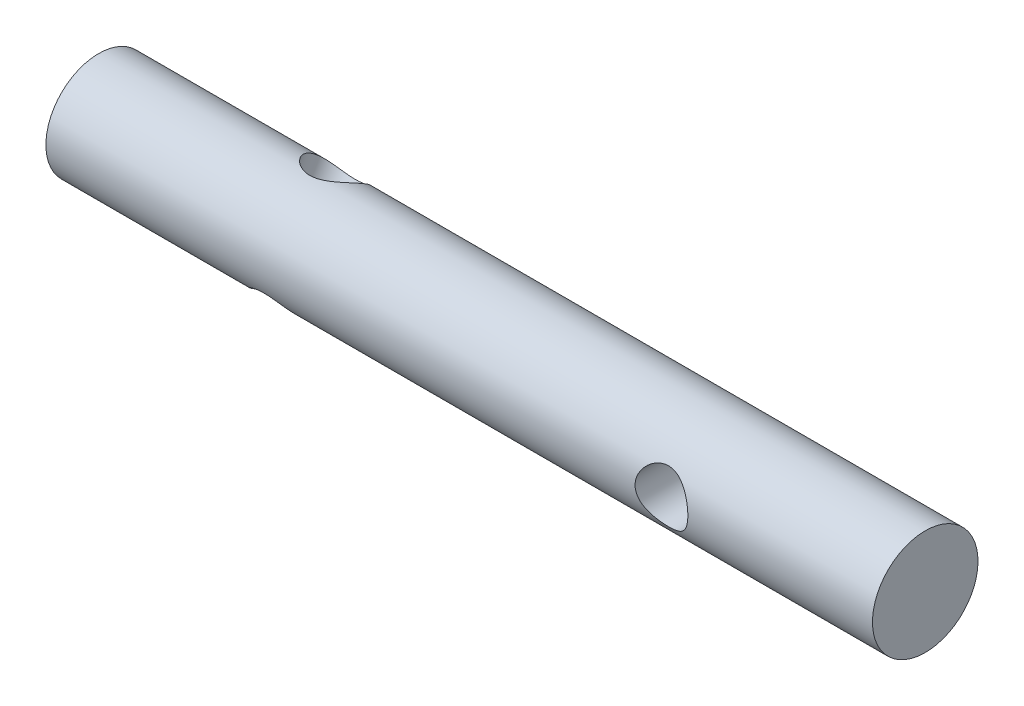
ISO-10303-21;
HEADER;
FILE_DESCRIPTION(('STEP AP214'),'2;1');
FILE_NAME('part.step','',(''),(''),'','','');
FILE_SCHEMA(('AUTOMOTIVE_DESIGN { 1 0 10303 214 1 1 1 1 }'));
ENDSEC;
DATA;
#1=APPLICATION_CONTEXT('core data for automotive mechanical design processes');
#2=APPLICATION_PROTOCOL_DEFINITION('international standard','automotive_design',2000,#1);
#3=PRODUCT_CONTEXT('',#1,'mechanical');
#4=PRODUCT('Part','Part','',(#3));
#5=PRODUCT_RELATED_PRODUCT_CATEGORY('part','',(#4));
#6=PRODUCT_DEFINITION_FORMATION('','',#4);
#7=PRODUCT_DEFINITION_CONTEXT('part definition',#1,'design');
#8=PRODUCT_DEFINITION('design','',#6,#7);
#9=PRODUCT_DEFINITION_SHAPE('','',#8);
#10=(LENGTH_UNIT() NAMED_UNIT(*) SI_UNIT(.MILLI.,.METRE.));
#11=(NAMED_UNIT(*) PLANE_ANGLE_UNIT() SI_UNIT($,.RADIAN.));
#12=(NAMED_UNIT(*) SI_UNIT($,.STERADIAN.) SOLID_ANGLE_UNIT());
#13=UNCERTAINTY_MEASURE_WITH_UNIT(LENGTH_MEASURE(1.E-05),#10,'distance_accuracy_value','');
#14=(GEOMETRIC_REPRESENTATION_CONTEXT(3) GLOBAL_UNCERTAINTY_ASSIGNED_CONTEXT((#13)) GLOBAL_UNIT_ASSIGNED_CONTEXT((#10,
#11,#12)) REPRESENTATION_CONTEXT('',''));
#15=CARTESIAN_POINT('',(0.,0.,0.));
#16=DIRECTION('',(0.,0.,1.));
#17=DIRECTION('',(1.,0.,0.));
#18=AXIS2_PLACEMENT_3D('',#15,#16,#17);
#19=CARTESIAN_POINT('',(23.5,0.,0.));
#20=DIRECTION('',(-1.,0.,0.));
#21=DIRECTION('',(0.,0.,1.));
#22=AXIS2_PLACEMENT_3D('',#19,#20,#21);
#23=CYLINDRICAL_SURFACE('',#22,3.);
#24=CARTESIAN_POINT('',(-11.5,-1.49999999999999,2.59807621135332));
#25=CARTESIAN_POINT('',(-11.4218382877071,-1.50000862495779,2.59807489163534));
#26=CARTESIAN_POINT('',(-11.3435778827124,-1.5061760913131,2.5945405203329));
#27=CARTESIAN_POINT('',(-11.1894591029843,-1.53024117474818,2.58041553106382));
#28=CARTESIAN_POINT('',(-11.1136061274349,-1.54816343991203,2.56981008531852));
#29=CARTESIAN_POINT('',(-10.9668225034841,-1.59396640241377,2.54164960362352));
#30=CARTESIAN_POINT('',(-10.8958680212896,-1.62179412158731,2.52413148619179));
#31=CARTESIAN_POINT('',(-10.7598636970049,-1.68537217841439,2.48212970182895));
#32=CARTESIAN_POINT('',(-10.6948141746063,-1.72112294465765,2.45764565806232));
#33=CARTESIAN_POINT('',(-10.5665414071637,-1.80168953690998,2.39928825432991));
#34=CARTESIAN_POINT('',(-10.5039112964897,-1.84700983188558,2.36480703823351));
#35=CARTESIAN_POINT('',(-10.3878874173899,-1.94208348109413,2.2873722217759));
#36=CARTESIAN_POINT('',(-10.3344982561247,-1.99183902794257,2.24441441804235));
#37=CARTESIAN_POINT('',(-10.2349492732785,-2.09685921277507,2.14677761574316));
#38=CARTESIAN_POINT('',(-10.1895193482107,-2.15226912728264,2.09150371252971));
#39=CARTESIAN_POINT('',(-10.1122887201314,-2.26255337256748,1.97166528686268));
#40=CARTESIAN_POINT('',(-10.0804794157942,-2.31742801990067,1.90710666216055));
#41=CARTESIAN_POINT('',(-10.0337430080484,-2.41999926836365,1.77485215024177));
#42=CARTESIAN_POINT('',(-10.0177757104667,-2.46792879153452,1.7077063502269));
#43=CARTESIAN_POINT('',(-9.99975082198745,-2.55874675688021,1.5683481287634));
#44=CARTESIAN_POINT('',(-9.99768481480644,-2.60163823378903,1.49613879970134));
#45=CARTESIAN_POINT('',(-10.0071200109555,-2.67737164944847,1.35554572990428));
#46=CARTESIAN_POINT('',(-10.0174570232818,-2.71076315078899,1.28737537231279));
#47=CARTESIAN_POINT('',(-10.049321265857,-2.77144236671133,1.15094836839947));
#48=CARTESIAN_POINT('',(-10.0708493334643,-2.7987296243312,1.08269171600203));
#49=CARTESIAN_POINT('',(-10.1246238491347,-2.84747758688166,0.94717164473698));
#50=CARTESIAN_POINT('',(-10.1570144697581,-2.86885245562036,0.879935033322773));
#51=CARTESIAN_POINT('',(-10.2313951243022,-2.90571806648624,0.749278055975659));
#52=CARTESIAN_POINT('',(-10.2733885949535,-2.92120669671257,0.685859066607907));
#53=CARTESIAN_POINT('',(-10.3703430272995,-2.94829088935395,0.558742216123417));
#54=CARTESIAN_POINT('',(-10.426154542489,-2.95938005266745,0.495584669819372));
#55=CARTESIAN_POINT('',(-10.5468845873953,-2.97671044952062,0.377816479613451));
#56=CARTESIAN_POINT('',(-10.6118100584111,-2.98294796407822,0.323212417851254));
#57=CARTESIAN_POINT('',(-10.7539722886361,-2.99227023377267,0.221560607904281));
#58=CARTESIAN_POINT('',(-10.8317290345813,-2.99512962226658,0.175212918700935));
#59=CARTESIAN_POINT('',(-10.9944065070385,-2.99867364292841,0.0974084034876274));
#60=CARTESIAN_POINT('',(-11.0793196495263,-2.99936054836896,0.0659360413893476));
#61=CARTESIAN_POINT('',(-11.2468217669242,-2.99999226031255,0.0222000573363196));
#62=CARTESIAN_POINT('',(-11.3290616785653,-2.99999156123136,0.00861186912431814));
#63=CARTESIAN_POINT('',(-11.4946020122748,-3.00000545022047,-0.00262428191709279));
#64=CARTESIAN_POINT('',(-11.5779016436797,-3.00002002748602,-0.000283504650606316));
#65=CARTESIAN_POINT('',(-11.7334808778681,-2.99995130492038,0.0189620158629173));
#66=CARTESIAN_POINT('',(-11.8059691766619,-2.99987853752529,0.0342455816704168));
#67=CARTESIAN_POINT('',(-11.9475516794064,-2.99910450282201,0.076219270443925));
#68=CARTESIAN_POINT('',(-12.0166447761199,-2.99840303189826,0.10291308733468));
#69=CARTESIAN_POINT('',(-12.153116996354,-2.99548924870391,0.16774709010822));
#70=CARTESIAN_POINT('',(-12.2202685252803,-2.99320846621349,0.206360156164835));
#71=CARTESIAN_POINT('',(-12.3482039073085,-2.98599270210303,0.292792513845168));
#72=CARTESIAN_POINT('',(-12.4089844652699,-2.98105635500875,0.340616533553197));
#73=CARTESIAN_POINT('',(-12.5304681512853,-2.96657996164929,0.450372735397793));
#74=CARTESIAN_POINT('',(-12.5901957260765,-2.95653803437976,0.513323404573123));
#75=CARTESIAN_POINT('',(-12.6991183569904,-2.93026376448239,0.646661329675235));
#76=CARTESIAN_POINT('',(-12.7483098553458,-2.91402933593293,0.717051085649247));
#77=CARTESIAN_POINT('',(-12.8358605889252,-2.8736660177982,0.864905303918102));
#78=CARTESIAN_POINT('',(-12.8738996773164,-2.84934008652963,0.942507452248859));
#79=CARTESIAN_POINT('',(-12.9357068557861,-2.79222195919353,1.10023034944633));
#80=CARTESIAN_POINT('',(-12.9594874770495,-2.75943723357327,1.18034882144499));
#81=CARTESIAN_POINT('',(-12.990052846262,-2.68899177768552,1.3325548653702));
#82=CARTESIAN_POINT('',(-12.9981968138142,-2.65205443487768,1.40470481159923));
#83=CARTESIAN_POINT('',(-13.0012648981816,-2.57227901151692,1.54594597206357));
#84=CARTESIAN_POINT('',(-12.9961936427853,-2.52944300157156,1.61503824843522));
#85=CARTESIAN_POINT('',(-12.9738753898066,-2.44242264231303,1.74361895509488));
#86=CARTESIAN_POINT('',(-12.9574527261135,-2.39851313854504,1.80344022145819));
#87=CARTESIAN_POINT('',(-12.9140095010455,-2.30851597393175,1.91729585296855));
#88=CARTESIAN_POINT('',(-12.8869874198598,-2.26242800155784,1.97132938681917));
#89=CARTESIAN_POINT('',(-12.821909421751,-2.16780033494524,2.07503760165361));
#90=CARTESIAN_POINT('',(-12.7834310151882,-2.11924008859603,2.12442700907887));
#91=CARTESIAN_POINT('',(-12.6970631037114,-2.02353053115523,2.21578630362708));
#92=CARTESIAN_POINT('',(-12.6491692763265,-1.97638187960329,2.25775276611944));
#93=CARTESIAN_POINT('',(-12.539804291466,-1.8808922217153,2.33805741522681));
#94=CARTESIAN_POINT('',(-12.4774562687842,-1.83289952499329,2.37561886789369));
#95=CARTESIAN_POINT('',(-12.3438239183053,-1.74357127017655,2.44193825832237));
#96=CARTESIAN_POINT('',(-12.2725317686985,-1.70224161222176,2.47068841372991));
#97=CARTESIAN_POINT('',(-12.1200450301286,-1.62795939102566,2.52027978123214));
#98=CARTESIAN_POINT('',(-12.0386087033069,-1.59531283502097,2.54084234346503));
#99=CARTESIAN_POINT('',(-11.8700013934903,-1.54341897250758,2.57270461210165));
#100=CARTESIAN_POINT('',(-11.782850666631,-1.52412686979804,2.58403530875992));
#101=CARTESIAN_POINT('',(-11.662291966522,-1.50843611970246,2.59319017875699));
#102=CARTESIAN_POINT('',(-11.6299481584032,-1.50528059539496,2.59502139928294));
#103=CARTESIAN_POINT('',(-11.5650752789766,-1.50106066990054,2.59746473112138));
#104=CARTESIAN_POINT('',(-11.5325461954212,-1.49999640860525,2.59807676087813));
#105=CARTESIAN_POINT('',(-11.5,-1.49999999999999,2.59807621135332));
#106=B_SPLINE_CURVE_WITH_KNOTS('',3,(#24,#25,#26,#27,#28,#29,#30,#31,#32,#33,#34,#35,#36,#37,
#38,#39,#40,#41,#42,#43,#44,#45,#46,#47,#48,#49,#50,#51,#52,#53,#54,#55,#56,#57,#58,#59,#60,#61,
#62,#63,#64,#65,#66,#67,#68,#69,#70,#71,#72,#73,#74,#75,#76,#77,#78,#79,#80,#81,#82,#83,#84,#85,
#86,#87,#88,#89,#90,#91,#92,#93,#94,#95,#96,#97,#98,#99,#100,#101,#102,#103,#104,#105),
.UNSPECIFIED.,.T.,.F.,(4,2,2,2,2,2,2,2,2,2,2,2,2,2,2,2,2,2,2,2,2,2,2,2,2,2,2,2,2,2,2,2,2,2,2,2,
2,2,2,2,4),(0.,0.234348183892073,0.469189339237207,0.702792893878327,0.936409088167724,
1.18929346874735,1.44230356626557,1.71236838358145,1.98226240445837,2.23295227451903,
2.4834903552906,2.71224146226808,2.94100968776183,3.1729430209672,3.40495949025408,
3.65890787185336,3.91305072368878,4.18333262594173,4.45333161317557,4.70193436281318,
4.9503613978256,5.17161275136038,5.39293578654095,5.62450944609132,5.85620229330071,
6.1171011537092,6.37808797467303,6.64596272119449,6.91360169713158,7.1566840558423,
7.39968130190958,7.62666637307239,7.8536840026802,8.09041126079208,8.32724745151079,
8.58765362775102,8.84828914267732,9.11716123557908,9.38512699504141,9.48270202777964,
9.58028358741811),.UNSPECIFIED.);
#107=CARTESIAN_POINT('',(-11.5,-1.49999999999999,2.59807621135332));
#108=VERTEX_POINT('',#107);
#109=EDGE_CURVE('E47',#108,#108,#106,.T.);
#110=ORIENTED_EDGE('',*,*,#109,.T.);
#111=EDGE_LOOP('',(#110));
#112=FACE_BOUND('',#111,.T.);
#113=CARTESIAN_POINT('',(-11.5,3.,0.));
#114=CARTESIAN_POINT('',(-11.5781617122929,3.0000031695696,-8.12929157027599E-06));
#115=CARTESIAN_POINT('',(-11.6564221172876,3.00002604741293,-0.00711649748346975));
#116=CARTESIAN_POINT('',(-11.8105408970157,2.99982598959527,-0.0350199657169843));
#117=CARTESIAN_POINT('',(-11.8863938725651,2.99960253674331,-0.0558438255148888));
#118=CARTESIAN_POINT('',(-12.0331774965159,2.9981163254635,-0.109590595457481));
#119=CARTESIAN_POINT('',(-12.1041319787104,2.99685905032792,-0.142449165907009));
#120=CARTESIAN_POINT('',(-12.2401363029951,2.99227346647896,-0.218510270423935));
#121=CARTESIAN_POINT('',(-12.3051858253937,2.98894504571132,-0.261713364078666));
#122=CARTESIAN_POINT('',(-12.4334585928363,2.97868934770631,-0.360664781531734));
#123=CARTESIAN_POINT('',(-12.4960887035103,2.97148788610125,-0.417153916335811));
#124=CARTESIAN_POINT('',(-12.6121125826101,2.95196419251584,-0.538207520009709));
#125=CARTESIAN_POINT('',(-12.6655017438753,2.93963941661602,-0.602775989426423));
#126=CARTESIAN_POINT('',(-12.7650507267215,2.9075935578969,-0.742544538551094));
#127=CARTESIAN_POINT('',(-12.8104806517893,2.88742991080151,-0.818167883742899));
#128=CARTESIAN_POINT('',(-12.8877112798686,2.83878891246674,-0.973596054630283));
#129=CARTESIAN_POINT('',(-12.9195205842058,2.81031682710791,-1.0533982055956));
#130=CARTESIAN_POINT('',(-12.9662569919516,2.74706668425262,-1.20835476842182));
#131=CARTESIAN_POINT('',(-12.9822242895333,2.71288147726775,-1.2834358530865));
#132=CARTESIAN_POINT('',(-13.0002491780126,2.63760269992698,-1.43176562892763));
#133=CARTESIAN_POINT('',(-13.0023151851936,2.59651332502342,-1.50501540206753));
#134=CARTESIAN_POINT('',(-12.9928799890445,2.51262286281284,-1.6408989988425));
#135=CARTESIAN_POINT('',(-12.9825429767182,2.4702813520238,-1.70390206606964));
#136=CARTESIAN_POINT('',(-12.950678734143,2.38247170883384,-1.82466531049676));
#137=CARTESIAN_POINT('',(-12.9291506665357,2.3370033426903,-1.8824250949939));
#138=CARTESIAN_POINT('',(-12.8753761508653,2.24401349952733,-1.99240210457786));
#139=CARTESIAN_POINT('',(-12.8429855302419,2.19647232034759,-2.04453158961524));
#140=CARTESIAN_POINT('',(-12.7686048756978,2.10175286421624,-2.14178663382467));
#141=CARTESIAN_POINT('',(-12.7266114050465,2.0545747234546,-2.18690967575438));
#142=CARTESIAN_POINT('',(-12.6296569727005,1.95803039800665,-2.27392369986504));
#143=CARTESIAN_POINT('',(-12.573845457511,1.90887894012341,-2.31510597015328));
#144=CARTESIAN_POINT('',(-12.4531154126047,1.81555389407394,-2.38899862918875));
#145=CARTESIAN_POINT('',(-12.3881899415889,1.77138414671687,-2.4217025061332));
#146=CARTESIAN_POINT('',(-12.2460277113639,1.68801223180934,-2.48060173348301));
#147=CARTESIAN_POINT('',(-12.1682709654187,1.6493036497995,-2.5062518811597));
#148=CARTESIAN_POINT('',(-12.0055934929615,1.58369497342655,-2.54822335069103));
#149=CARTESIAN_POINT('',(-11.9206803504737,1.55678256105261,-2.56455440930168));
#150=CARTESIAN_POINT('',(-11.7531782330758,1.51922194377497,-2.58696947991922));
#151=CARTESIAN_POINT('',(-11.6709383214347,1.50745387805138,-2.59376296860315));
#152=CARTESIAN_POINT('',(-11.5053979877252,1.49773003030331,-2.59939307234126));
#153=CARTESIAN_POINT('',(-11.4220983563203,1.49976449151347,-2.5982353079903));
#154=CARTESIAN_POINT('',(-11.2665191221319,1.51639723990441,-2.58855303224588));
#155=CARTESIAN_POINT('',(-11.1940308233381,1.52959681245658,-2.58084823092942));
#156=CARTESIAN_POINT('',(-11.0524483205936,1.56556007587334,-2.55919105282621));
#157=CARTESIAN_POINT('',(-10.9833552238801,1.58832686396282,-2.54523665274085));
#158=CARTESIAN_POINT('',(-10.846883003646,1.64301786579657,-2.51029624108665));
#159=CARTESIAN_POINT('',(-10.7797314747197,1.67531737067439,-2.48901449248114));
#160=CARTESIAN_POINT('',(-10.6517960926915,1.74656210607932,-2.4395492786136));
#161=CARTESIAN_POINT('',(-10.5910155347301,1.78551074851042,-2.41136226677404));
#162=CARTESIAN_POINT('',(-10.4695318487147,1.873324210851,-2.34394724144727));
#163=CARTESIAN_POINT('',(-10.4098042739235,1.9228201259073,-2.30377534274124));
#164=CARTESIAN_POINT('',(-10.3008816430096,2.02515702138495,-2.21435219499318));
#165=CARTESIAN_POINT('',(-10.2516901446542,2.07799912394991,-2.16509788946642));
#166=CARTESIAN_POINT('',(-10.1641394110749,2.18586297396006,-2.05621512144628));
#167=CARTESIAN_POINT('',(-10.1261003226836,2.24090544016846,-1.9963471728316));
#168=CARTESIAN_POINT('',(-10.0642931442139,2.3489384122319,-1.86801997494321));
#169=CARTESIAN_POINT('',(-10.0405125229505,2.401930681485,-1.79956833370063));
#170=CARTESIAN_POINT('',(-10.009947153738,2.49852225418989,-1.66245775735806));
#171=CARTESIAN_POINT('',(-10.0018031861858,2.54253726910199,-1.59439410702366));
#172=CARTESIAN_POINT('',(-9.9987351018184,2.62496799044373,-1.45468598356342));
#173=CARTESIAN_POINT('',(-10.0038063572147,2.6633856520142,-1.38304277256815));
#174=CARTESIAN_POINT('',(-10.0261246101934,2.73122963078875,-1.24339057747398));
#175=CARTESIAN_POINT('',(-10.0425472738865,2.76108161526194,-1.17545319856168));
#176=CARTESIAN_POINT('',(-10.0859904989545,2.81468490220718,-1.04058555198283));
#177=CARTESIAN_POINT('',(-10.1130125801402,2.83843532899111,-0.973655430172794));
#178=CARTESIAN_POINT('',(-10.178090578249,2.88093544431257,-0.839851359568215));
#179=CARTESIAN_POINT('',(-10.2165689848118,2.8994278026461,-0.773102248903138));
#180=CARTESIAN_POINT('',(-10.3029368962886,2.93069249387628,-0.64453569350034));
#181=CARTESIAN_POINT('',(-10.3508307236735,2.94346219072566,-0.582720532255996));
#182=CARTESIAN_POINT('',(-10.4601957085341,2.96526322795065,-0.459871738172625));
#183=CARTESIAN_POINT('',(-10.5225437312158,2.97379605180221,-0.399528117281799));
#184=CARTESIAN_POINT('',(-10.6561760816947,2.98656620126857,-0.289007884120435));
#185=CARTESIAN_POINT('',(-10.7274682313015,2.99079973723686,-0.238840272698094));
#186=CARTESIAN_POINT('',(-10.8799549698714,2.99660601070415,-0.149714298341622));
#187=CARTESIAN_POINT('',(-10.9613912966931,2.99809043396239,-0.111160270379043));
#188=CARTESIAN_POINT('',(-11.1299986065097,2.99973703676721,-0.0502877328236442));
#189=CARTESIAN_POINT('',(-11.217149333369,2.99990365656108,-0.0279149334556331));
#190=CARTESIAN_POINT('',(-11.337708033478,2.99998663149909,-0.00974891026988721));
#191=CARTESIAN_POINT('',(-11.3700518415968,2.99999475284075,-0.00610053579435659));
#192=CARTESIAN_POINT('',(-11.4349247210234,3.0000007775355,-0.001224307194897));
#193=CARTESIAN_POINT('',(-11.4674538045788,2.99999868020507,3.3850014643778E-06));
#194=CARTESIAN_POINT('',(-11.5,3.,0.));
#195=B_SPLINE_CURVE_WITH_KNOTS('',3,(#113,#114,#115,#116,#117,#118,#119,#120,#121,#122,#123,
#124,#125,#126,#127,#128,#129,#130,#131,#132,#133,#134,#135,#136,#137,#138,#139,#140,#141,#142,
#143,#144,#145,#146,#147,#148,#149,#150,#151,#152,#153,#154,#155,#156,#157,#158,#159,#160,#161,
#162,#163,#164,#165,#166,#167,#168,#169,#170,#171,#172,#173,#174,#175,#176,#177,#178,#179,#180,
#181,#182,#183,#184,#185,#186,#187,#188,#189,#190,#191,#192,#193,#194),.UNSPECIFIED.,.T.,.F.,(4,
2,2,2,2,2,2,2,2,2,2,2,2,2,2,2,2,2,2,2,2,2,2,2,2,2,2,2,2,2,2,2,2,2,2,2,2,2,2,2,4),(0.,
0.234348183892073,0.469189339237207,0.702792893878329,0.936409088167725,1.18929346874735,
1.44230356626556,1.71236838358145,1.98226240445837,2.23295227451903,2.4834903552906,
2.71224146226808,2.94100968776183,3.1729430209672,3.40495949025408,3.65890787185336,
3.91305072368878,4.18333262594172,4.45333161317557,4.70193436281318,4.9503613978256,
5.17161275136038,5.39293578654095,5.62450944609132,5.85620229330071,6.1171011537092,
6.37808797467304,6.64596272119449,6.91360169713158,7.1566840558423,7.39968130190958,
7.62666637307239,7.8536840026802,8.09041126079208,8.32724745151079,8.58765362775102,
8.84828914267732,9.11716123557907,9.38512699504141,9.48270202777964,9.58028358741811),.UNSPECIFIED.);
#196=CARTESIAN_POINT('',(-11.5,3.,0.));
#197=VERTEX_POINT('',#196);
#198=EDGE_CURVE('E75',#197,#197,#195,.T.);
#199=ORIENTED_EDGE('',*,*,#198,.T.);
#200=EDGE_LOOP('',(#199));
#201=FACE_BOUND('',#200,.T.);
#202=CARTESIAN_POINT('',(13.,0.,-3.));
#203=CARTESIAN_POINT('',(12.9999950465242,0.0788579444268494,-2.99999570107562));
#204=CARTESIAN_POINT('',(12.9937448903184,0.157809899546343,-2.99685736529635));
#205=CARTESIAN_POINT('',(12.9690206794877,0.313380352903343,-2.98461234055736));
#206=CARTESIAN_POINT('',(12.9505234105033,0.389994130070444,-2.97549431743379));
#207=CARTESIAN_POINT('',(12.9022092870751,0.538400317320673,-2.95224419105063));
#208=CARTESIAN_POINT('',(12.872436423628,0.610210204408719,-2.93813158766306));
#209=CARTESIAN_POINT('',(12.8026440679525,0.747708925209898,-2.90618664773642));
#210=CARTESIAN_POINT('',(12.7626253836267,0.813398240985089,-2.88835460450288));
#211=CARTESIAN_POINT('',(12.6707241257721,0.941261726642864,-2.84934387387093));
#212=CARTESIAN_POINT('',(12.6182702811405,1.00298281668316,-2.82802798691306));
#213=CARTESIAN_POINT('',(12.5042177811294,1.11716916730047,-2.78489955370115));
#214=CARTESIAN_POINT('',(12.4426122223413,1.16962737466015,-2.76308664313552));
#215=CARTESIAN_POINT('',(12.3062749757149,1.26787800067542,-2.71948426796021));
#216=CARTESIAN_POINT('',(12.2308958524811,1.31283800332745,-2.69782780455198));
#217=CARTESIAN_POINT('',(12.0724489960207,1.38925234033604,-2.65928968158481));
#218=CARTESIAN_POINT('',(11.9893868069159,1.4207163224495,-2.64240461410484));
#219=CARTESIAN_POINT('',(11.8230023418671,1.46719866328288,-2.61686800556713));
#220=CARTESIAN_POINT('',(11.7399933218989,1.48308878562066,-2.6077840737557));
#221=CARTESIAN_POINT('',(11.5720317433308,1.50064048996327,-2.59772834922792));
#222=CARTESIAN_POINT('',(11.4870811886933,1.50231613255961,-2.59674854014932));
#223=CARTESIAN_POINT('',(11.3285709635269,1.49203093075844,-2.60266395385873));
#224=CARTESIAN_POINT('',(11.2548639531654,1.48167683930523,-2.6086314549302));
#225=CARTESIAN_POINT('',(11.1104171359404,1.4504097735854,-2.62614343100775));
#226=CARTESIAN_POINT('',(11.039678282042,1.42949343584648,-2.63768968247664));
#227=CARTESIAN_POINT('',(10.9011563011515,1.37731467057901,-2.66531214619112));
#228=CARTESIAN_POINT('',(10.8334804018213,1.34582260067399,-2.68148760995998));
#229=CARTESIAN_POINT('',(10.704048561115,1.273562531502,-2.71655106422106));
#230=CARTESIAN_POINT('',(10.6422952965999,1.2327903657187,-2.73544027170286));
#231=CARTESIAN_POINT('',(10.5182181208852,1.13709908236918,-2.77669736854929));
#232=CARTESIAN_POINT('',(10.4568146896358,1.08104168755392,-2.79920265355119));
#233=CARTESIAN_POINT('',(10.3438968721136,0.95933336811206,-2.84321434950611));
#234=CARTESIAN_POINT('',(10.2923872119492,0.893677884861427,-2.86472027938201));
#235=CARTESIAN_POINT('',(10.1984715084554,0.750774758747771,-2.90552980924446));
#236=CARTESIAN_POINT('',(10.1565992913314,0.673130387399111,-2.92468476243011));
#237=CARTESIAN_POINT('',(10.0868544564355,0.510699323233193,-2.95736821681863));
#238=CARTESIAN_POINT('',(10.0589707224772,0.425918364397912,-2.9709011841533));
#239=CARTESIAN_POINT('',(10.020286894425,0.259149737491052,-2.98986500612153));
#240=CARTESIAN_POINT('',(10.0082631463798,0.177512295822488,-2.99587407451965));
#241=CARTESIAN_POINT('',(9.99780290329827,0.0131693999240261,-3.00109520188655));
#242=CARTESIAN_POINT('',(9.9993599715408,-0.0695355298048644,-3.00031048081978));
#243=CARTESIAN_POINT('',(10.0153100326281,-0.226849457978981,-2.99236788380152));
#244=CARTESIAN_POINT('',(10.028698799095,-0.301589112074896,-2.98570868532252));
#245=CARTESIAN_POINT('',(10.0663571078427,-0.447610338452912,-2.9673325697226));
#246=CARTESIAN_POINT('',(10.0906278496802,-0.518891528536631,-2.95561509501618));
#247=CARTESIAN_POINT('',(10.1499976996495,-0.65833291267436,-2.92776377120382));
#248=CARTESIAN_POINT('',(10.1853865751744,-0.726345595508706,-2.91151322654446));
#249=CARTESIAN_POINT('',(10.2656613034698,-0.855692042548909,-2.87615961476126));
#250=CARTESIAN_POINT('',(10.3105512018931,-0.917022944664889,-2.85705533350407));
#251=CARTESIAN_POINT('',(10.4136406379961,-1.03765153393382,-2.81562332004297));
#252=CARTESIAN_POINT('',(10.4727143026677,-1.09615811672854,-2.79316327265249));
#253=CARTESIAN_POINT('',(10.5998877269166,-1.20278448167829,-2.7489358741323));
#254=CARTESIAN_POINT('',(10.6679936782719,-1.25089707856781,-2.72716901100071));
#255=CARTESIAN_POINT('',(10.8154654812595,-1.33756187171853,-2.68576788309734));
#256=CARTESIAN_POINT('',(10.8952168991417,-1.37553824370037,-2.66628794383591));
#257=CARTESIAN_POINT('',(11.0612651013624,-1.43712423890206,-2.63361108441202));
#258=CARTESIAN_POINT('',(11.1475532897003,-1.46075237380053,-2.62040607332625));
#259=CARTESIAN_POINT('',(11.3153653343271,-1.49079253120031,-2.60342251538703));
#260=CARTESIAN_POINT('',(11.3965513801529,-1.49863949460818,-2.59886075197597));
#261=CARTESIAN_POINT('',(11.5591706007468,-1.5010337315643,-2.59748031962405));
#262=CARTESIAN_POINT('',(11.6406036531068,-1.49558676993486,-2.60065829439585));
#263=CARTESIAN_POINT('',(11.7932252523002,-1.47288918838997,-2.61356793076615));
#264=CARTESIAN_POINT('',(11.8646507052171,-1.45681247151455,-2.62264641723988));
#265=CARTESIAN_POINT('',(12.0037121791365,-1.41476303733662,-2.64556524281479));
#266=CARTESIAN_POINT('',(12.071346973138,-1.38878713673988,-2.65940711354503));
#267=CARTESIAN_POINT('',(12.2059372764798,-1.32572361795085,-2.69142795546803));
#268=CARTESIAN_POINT('',(12.2725418527435,-1.28800670672355,-2.70983583593881));
#269=CARTESIAN_POINT('',(12.3989118042719,-1.20322645745609,-2.74852997452291));
#270=CARTESIAN_POINT('',(12.4586735957817,-1.15615825686234,-2.76881720693416));
#271=CARTESIAN_POINT('',(12.577212973532,-1.04730498999206,-2.81193484737138));
#272=CARTESIAN_POINT('',(12.6349886535254,-0.984426634495893,-2.83477474959942));
#273=CARTESIAN_POINT('',(12.7393944751529,-0.849232209349796,-2.87816628389896));
#274=CARTESIAN_POINT('',(12.7860186092049,-0.776911084957797,-2.89871667939293));
#275=CARTESIAN_POINT('',(12.8668545440681,-0.623897395174419,-2.93547014349806));
#276=CARTESIAN_POINT('',(12.9009762538547,-0.543149255665097,-2.95164144740899));
#277=CARTESIAN_POINT('',(12.9547122516361,-0.376113151707131,-2.9775201194848));
#278=CARTESIAN_POINT('',(12.9743677702086,-0.289841699383651,-2.98724585044602));
#279=CARTESIAN_POINT('',(12.9908461166286,-0.168902919736343,-2.99543192870217));
#280=CARTESIAN_POINT('',(12.9942739612995,-0.135242819162348,-2.99714048010376));
#281=CARTESIAN_POINT('',(12.9988519982711,-0.0677275977076376,-2.99942545465223));
#282=CARTESIAN_POINT('',(13.0000021277053,-0.0338724714699432,-3.00000184655071));
#283=CARTESIAN_POINT('',(13.,0.,-3.));
#284=B_SPLINE_CURVE_WITH_KNOTS('',3,(#202,#203,#204,#205,#206,#207,#208,#209,#210,#211,#212,
#213,#214,#215,#216,#217,#218,#219,#220,#221,#222,#223,#224,#225,#226,#227,#228,#229,#230,#231,
#232,#233,#234,#235,#236,#237,#238,#239,#240,#241,#242,#243,#244,#245,#246,#247,#248,#249,#250,
#251,#252,#253,#254,#255,#256,#257,#258,#259,#260,#261,#262,#263,#264,#265,#266,#267,#268,#269,
#270,#271,#272,#273,#274,#275,#276,#277,#278,#279,#280,#281,#282,#283),.UNSPECIFIED.,.T.,.F.,(4,
2,2,2,2,2,2,2,2,2,2,2,2,2,2,2,2,2,2,2,2,2,2,2,2,2,2,2,2,2,2,2,2,2,2,2,2,2,2,2,4),(0.,
0.236436386130439,0.473322224563797,0.709293233238449,0.945245640872352,1.19547263807713,
1.44588935648105,1.71572589646129,1.98536921847421,2.23887018210344,2.49212035993531,
2.71508568613981,2.93812205888518,3.16635360252731,3.39468781890333,3.65197412000818,
3.9093830189803,4.17874533321661,4.44789325368419,4.69474935707018,4.94148846767214,
5.16910359759183,5.39674382446397,5.63089284041848,5.86514176122509,6.12239415966628,
6.37982382923148,6.64972023242589,6.91926767918176,7.1629396125457,7.40650589797018,
7.62686895373283,7.84730293182526,8.08254685170431,8.31791341715446,8.58187864135757,
8.84598575071869,9.1119602049529,9.37717362931724,9.47872920200875,9.58028757766599),.UNSPECIFIED.);
#285=CARTESIAN_POINT('',(13.,0.,-3.));
#286=VERTEX_POINT('',#285);
#287=EDGE_CURVE('E10',#286,#286,#284,.T.);
#288=ORIENTED_EDGE('',*,*,#287,.T.);
#289=EDGE_LOOP('',(#288));
#290=FACE_BOUND('',#289,.T.);
#291=CARTESIAN_POINT('',(13.,0.,3.));
#292=CARTESIAN_POINT('',(12.9999950465242,-0.0788579444268502,2.99999570107561));
#293=CARTESIAN_POINT('',(12.9937448903184,-0.157809899546344,2.99685736529635));
#294=CARTESIAN_POINT('',(12.9690206794877,-0.313380352903344,2.98461234055736));
#295=CARTESIAN_POINT('',(12.9505234105033,-0.389994130070445,2.97549431743379));
#296=CARTESIAN_POINT('',(12.9022092870751,-0.538400317320674,2.95224419105063));
#297=CARTESIAN_POINT('',(12.872436423628,-0.61021020440872,2.93813158766306));
#298=CARTESIAN_POINT('',(12.8026440679525,-0.747708925209899,2.90618664773642));
#299=CARTESIAN_POINT('',(12.7626253836267,-0.81339824098509,2.88835460450288));
#300=CARTESIAN_POINT('',(12.6707241257721,-0.941261726642865,2.84934387387093));
#301=CARTESIAN_POINT('',(12.6182702811405,-1.00298281668316,2.82802798691306));
#302=CARTESIAN_POINT('',(12.5042177811294,-1.11716916730047,2.78489955370114));
#303=CARTESIAN_POINT('',(12.4426122223413,-1.16962737466015,2.76308664313552));
#304=CARTESIAN_POINT('',(12.3062749757149,-1.26787800067542,2.71948426796021));
#305=CARTESIAN_POINT('',(12.2308958524811,-1.31283800332746,2.69782780455198));
#306=CARTESIAN_POINT('',(12.0724489960207,-1.38925234033604,2.65928968158481));
#307=CARTESIAN_POINT('',(11.9893868069159,-1.4207163224495,2.64240461410484));
#308=CARTESIAN_POINT('',(11.8230023418671,-1.46719866328288,2.61686800556713));
#309=CARTESIAN_POINT('',(11.7399933218989,-1.48308878562066,2.6077840737557));
#310=CARTESIAN_POINT('',(11.5720317433308,-1.50064048996327,2.59772834922792));
#311=CARTESIAN_POINT('',(11.4870811886933,-1.50231613255961,2.59674854014932));
#312=CARTESIAN_POINT('',(11.3285709635269,-1.49203093075844,2.60266395385873));
#313=CARTESIAN_POINT('',(11.2548639531654,-1.48167683930523,2.6086314549302));
#314=CARTESIAN_POINT('',(11.1104171359404,-1.4504097735854,2.62614343100775));
#315=CARTESIAN_POINT('',(11.039678282042,-1.42949343584648,2.63768968247664));
#316=CARTESIAN_POINT('',(10.9011563011515,-1.37731467057901,2.66531214619112));
#317=CARTESIAN_POINT('',(10.8334804018213,-1.34582260067399,2.68148760995998));
#318=CARTESIAN_POINT('',(10.704048561115,-1.27356253150201,2.71655106422105));
#319=CARTESIAN_POINT('',(10.6422952965999,-1.2327903657187,2.73544027170286));
#320=CARTESIAN_POINT('',(10.5182181208852,-1.13709908236919,2.77669736854929));
#321=CARTESIAN_POINT('',(10.4568146896358,-1.08104168755393,2.79920265355119));
#322=CARTESIAN_POINT('',(10.3438968721136,-0.959333368112063,2.84321434950611));
#323=CARTESIAN_POINT('',(10.2923872119492,-0.893677884861431,2.86472027938201));
#324=CARTESIAN_POINT('',(10.1984715084554,-0.750774758747776,2.90552980924446));
#325=CARTESIAN_POINT('',(10.1565992913314,-0.673130387399116,2.92468476243011));
#326=CARTESIAN_POINT('',(10.0868544564355,-0.510699323233198,2.95736821681863));
#327=CARTESIAN_POINT('',(10.0589707224772,-0.425918364397917,2.9709011841533));
#328=CARTESIAN_POINT('',(10.020286894425,-0.259149737491057,2.98986500612153));
#329=CARTESIAN_POINT('',(10.0082631463798,-0.177512295822492,2.99587407451965));
#330=CARTESIAN_POINT('',(9.99780290329827,-0.0131693999240301,3.00109520188655));
#331=CARTESIAN_POINT('',(9.9993599715408,0.0695355298048605,3.00031048081978));
#332=CARTESIAN_POINT('',(10.0153100326281,0.226849457978978,2.99236788380152));
#333=CARTESIAN_POINT('',(10.028698799095,0.301589112074893,2.98570868532253));
#334=CARTESIAN_POINT('',(10.0663571078427,0.44761033845291,2.9673325697226));
#335=CARTESIAN_POINT('',(10.0906278496802,0.518891528536628,2.95561509501618));
#336=CARTESIAN_POINT('',(10.1499976996495,0.658332912674357,2.92776377120382));
#337=CARTESIAN_POINT('',(10.1853865751744,0.726345595508702,2.91151322654446));
#338=CARTESIAN_POINT('',(10.2656613034698,0.855692042548905,2.87615961476127));
#339=CARTESIAN_POINT('',(10.3105512018931,0.917022944664885,2.85705533350408));
#340=CARTESIAN_POINT('',(10.4136406379961,1.03765153393382,2.81562332004297));
#341=CARTESIAN_POINT('',(10.4727143026677,1.09615811672854,2.79316327265249));
#342=CARTESIAN_POINT('',(10.5998877269166,1.20278448167828,2.7489358741323));
#343=CARTESIAN_POINT('',(10.6679936782719,1.25089707856781,2.72716901100071));
#344=CARTESIAN_POINT('',(10.8154654812595,1.33756187171852,2.68576788309734));
#345=CARTESIAN_POINT('',(10.8952168991417,1.37553824370037,2.66628794383591));
#346=CARTESIAN_POINT('',(11.0612651013624,1.43712423890205,2.63361108441202));
#347=CARTESIAN_POINT('',(11.1475532897003,1.46075237380052,2.62040607332625));
#348=CARTESIAN_POINT('',(11.3153653343271,1.49079253120031,2.60342251538703));
#349=CARTESIAN_POINT('',(11.3965513801529,1.49863949460818,2.59886075197597));
#350=CARTESIAN_POINT('',(11.5591706007468,1.5010337315643,2.59748031962405));
#351=CARTESIAN_POINT('',(11.6406036531068,1.49558676993486,2.60065829439585));
#352=CARTESIAN_POINT('',(11.7932252523002,1.47288918838996,2.61356793076615));
#353=CARTESIAN_POINT('',(11.8646507052171,1.45681247151455,2.62264641723988));
#354=CARTESIAN_POINT('',(12.0037121791365,1.41476303733662,2.64556524281479));
#355=CARTESIAN_POINT('',(12.071346973138,1.38878713673988,2.65940711354503));
#356=CARTESIAN_POINT('',(12.2059372764798,1.32572361795085,2.69142795546803));
#357=CARTESIAN_POINT('',(12.2725418527435,1.28800670672355,2.70983583593881));
#358=CARTESIAN_POINT('',(12.3989118042719,1.20322645745609,2.74852997452291));
#359=CARTESIAN_POINT('',(12.4586735957817,1.15615825686234,2.76881720693416));
#360=CARTESIAN_POINT('',(12.577212973532,1.04730498999206,2.81193484737138));
#361=CARTESIAN_POINT('',(12.6349886535254,0.984426634495893,2.83477474959942));
#362=CARTESIAN_POINT('',(12.7393944751529,0.849232209349797,2.87816628389896));
#363=CARTESIAN_POINT('',(12.7860186092049,0.776911084957798,2.89871667939293));
#364=CARTESIAN_POINT('',(12.8668545440681,0.623897395174421,2.93547014349806));
#365=CARTESIAN_POINT('',(12.9009762538547,0.543149255665098,2.95164144740899));
#366=CARTESIAN_POINT('',(12.9547122516361,0.376113151707132,2.9775201194848));
#367=CARTESIAN_POINT('',(12.9743677702086,0.289841699383651,2.98724585044602));
#368=CARTESIAN_POINT('',(12.9908461166286,0.168902919736343,2.99543192870217));
#369=CARTESIAN_POINT('',(12.9942739612995,0.135242819162347,2.99714048010376));
#370=CARTESIAN_POINT('',(12.9988519982711,0.0677275977076371,2.99942545465223));
#371=CARTESIAN_POINT('',(13.0000021277053,0.0338724714699425,3.00000184655071));
#372=CARTESIAN_POINT('',(13.,0.,3.));
#373=B_SPLINE_CURVE_WITH_KNOTS('',3,(#291,#292,#293,#294,#295,#296,#297,#298,#299,#300,#301,
#302,#303,#304,#305,#306,#307,#308,#309,#310,#311,#312,#313,#314,#315,#316,#317,#318,#319,#320,
#321,#322,#323,#324,#325,#326,#327,#328,#329,#330,#331,#332,#333,#334,#335,#336,#337,#338,#339,
#340,#341,#342,#343,#344,#345,#346,#347,#348,#349,#350,#351,#352,#353,#354,#355,#356,#357,#358,
#359,#360,#361,#362,#363,#364,#365,#366,#367,#368,#369,#370,#371,#372),.UNSPECIFIED.,.T.,.F.,(4,
2,2,2,2,2,2,2,2,2,2,2,2,2,2,2,2,2,2,2,2,2,2,2,2,2,2,2,2,2,2,2,2,2,2,2,2,2,2,2,4),(0.,
0.236436386130439,0.473322224563797,0.709293233238449,0.945245640872353,1.19547263807713,
1.44588935648105,1.71572589646129,1.98536921847421,2.23887018210344,2.4921203599353,
2.71508568613981,2.93812205888518,3.16635360252731,3.39468781890332,3.65197412000818,
3.90938301898029,4.17874533321661,4.44789325368419,4.69474935707018,4.94148846767214,
5.16910359759183,5.39674382446397,5.63089284041848,5.86514176122509,6.12239415966628,
6.37982382923148,6.64972023242589,6.91926767918176,7.1629396125457,7.40650589797018,
7.62686895373284,7.84730293182526,8.08254685170431,8.31791341715446,8.58187864135757,
8.84598575071869,9.1119602049529,9.37717362931724,9.47872920200876,9.580287577666),.UNSPECIFIED.);
#374=CARTESIAN_POINT('',(13.,0.,3.));
#375=VERTEX_POINT('',#374);
#376=EDGE_CURVE('E60',#375,#375,#373,.T.);
#377=ORIENTED_EDGE('',*,*,#376,.T.);
#378=EDGE_LOOP('',(#377));
#379=FACE_BOUND('',#378,.T.);
#380=CARTESIAN_POINT('',(23.5,0.,0.));
#381=DIRECTION('',(1.,0.,0.));
#382=DIRECTION('',(0.,0.,-1.));
#383=AXIS2_PLACEMENT_3D('',#380,#381,#382);
#384=CIRCLE('',#383,3.);
#385=CARTESIAN_POINT('',(23.5,0.,-3.));
#386=VERTEX_POINT('',#385);
#387=EDGE_CURVE('E65',#386,#386,#384,.T.);
#388=ORIENTED_EDGE('',*,*,#387,.F.);
#389=EDGE_LOOP('',(#388));
#390=FACE_BOUND('',#389,.T.);
#391=CARTESIAN_POINT('',(-23.5,0.,0.));
#392=DIRECTION('',(1.,0.,0.));
#393=DIRECTION('',(0.,0.,-1.));
#394=AXIS2_PLACEMENT_3D('',#391,#392,#393);
#395=CIRCLE('',#394,3.);
#396=CARTESIAN_POINT('',(-23.5,0.,-3.));
#397=VERTEX_POINT('',#396);
#398=EDGE_CURVE('E109',#397,#397,#395,.T.);
#399=ORIENTED_EDGE('',*,*,#398,.T.);
#400=EDGE_LOOP('',(#399));
#401=FACE_BOUND('',#400,.T.);
#402=ADVANCED_FACE('F44',(#112,#201,#290,#379,#390,#401),#23,.T.);
#403=CARTESIAN_POINT('',(23.5,0.,0.));
#404=DIRECTION('',(1.,0.,0.));
#405=DIRECTION('',(0.,0.,-1.));
#406=AXIS2_PLACEMENT_3D('',#403,#404,#405);
#407=PLANE('',#406);
#408=ORIENTED_EDGE('',*,*,#387,.T.);
#409=EDGE_LOOP('',(#408));
#410=FACE_BOUND('',#409,.T.);
#411=ADVANCED_FACE('F81',(#410),#407,.T.);
#412=CARTESIAN_POINT('',(-23.5,0.,0.));
#413=DIRECTION('',(1.,0.,0.));
#414=DIRECTION('',(0.,0.,-1.));
#415=AXIS2_PLACEMENT_3D('',#412,#413,#414);
#416=PLANE('',#415);
#417=ORIENTED_EDGE('',*,*,#398,.F.);
#418=EDGE_LOOP('',(#417));
#419=FACE_BOUND('',#418,.T.);
#420=ADVANCED_FACE('F82',(#419),#416,.F.);
#421=CARTESIAN_POINT('',(11.5,0.,-3.));
#422=DIRECTION('',(0.,0.,1.));
#423=DIRECTION('',(1.,0.,0.));
#424=AXIS2_PLACEMENT_3D('',#421,#422,#423);
#425=CYLINDRICAL_SURFACE('',#424,1.5);
#426=ORIENTED_EDGE('',*,*,#376,.F.);
#427=EDGE_LOOP('',(#426));
#428=FACE_BOUND('',#427,.T.);
#429=ORIENTED_EDGE('',*,*,#287,.F.);
#430=EDGE_LOOP('',(#429));
#431=FACE_BOUND('',#430,.T.);
#432=ADVANCED_FACE('F77',(#428,#431),#425,.F.);
#433=CARTESIAN_POINT('',(-11.5,-3.54903810567665,2.04903810567668));
#434=DIRECTION('',(0.,0.866025403784436,-0.500000000000004));
#435=DIRECTION('',(0.,0.500000000000004,0.866025403784436));
#436=AXIS2_PLACEMENT_3D('',#433,#434,#435);
#437=CYLINDRICAL_SURFACE('',#436,1.5);
#438=ORIENTED_EDGE('',*,*,#198,.F.);
#439=EDGE_LOOP('',(#438));
#440=FACE_BOUND('',#439,.T.);
#441=ORIENTED_EDGE('',*,*,#109,.F.);
#442=EDGE_LOOP('',(#441));
#443=FACE_BOUND('',#442,.T.);
#444=ADVANCED_FACE('F78',(#440,#443),#437,.F.);
#445=CLOSED_SHELL('',(#402,#411,#420,#432,#444));
#446=MANIFOLD_SOLID_BREP('B2',#445);
#447=ADVANCED_BREP_SHAPE_REPRESENTATION('',(#18,#446),#14);
#448=SHAPE_DEFINITION_REPRESENTATION(#9,#447);
ENDSEC;
END-ISO-10303-21;
